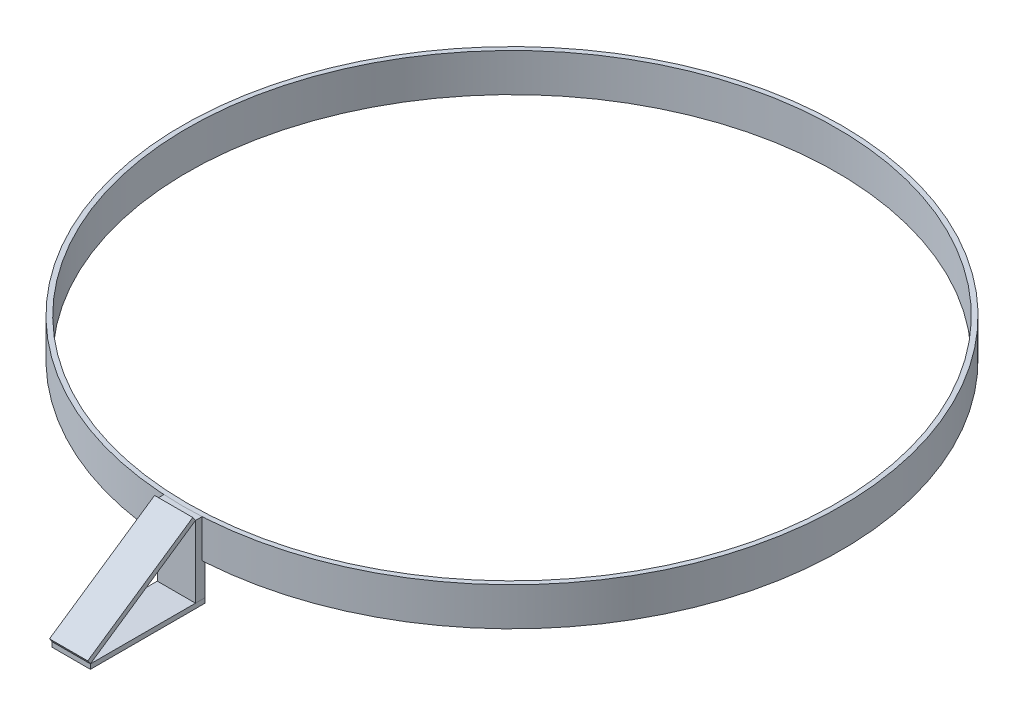
ISO-10303-21;
HEADER;
FILE_DESCRIPTION(('STEP AP214'),'2;1');
FILE_NAME('part.step','',(''),(''),'','','');
FILE_SCHEMA(('AUTOMOTIVE_DESIGN { 1 0 10303 214 1 1 1 1 }'));
ENDSEC;
DATA;
#1=APPLICATION_CONTEXT('core data for automotive mechanical design processes');
#2=APPLICATION_PROTOCOL_DEFINITION('international standard','automotive_design',2000,#1);
#3=PRODUCT_CONTEXT('',#1,'mechanical');
#4=PRODUCT('Part','Part','',(#3));
#5=PRODUCT_RELATED_PRODUCT_CATEGORY('part','',(#4));
#6=PRODUCT_DEFINITION_FORMATION('','',#4);
#7=PRODUCT_DEFINITION_CONTEXT('part definition',#1,'design');
#8=PRODUCT_DEFINITION('design','',#6,#7);
#9=PRODUCT_DEFINITION_SHAPE('','',#8);
#10=(LENGTH_UNIT() NAMED_UNIT(*) SI_UNIT(.MILLI.,.METRE.));
#11=(NAMED_UNIT(*) PLANE_ANGLE_UNIT() SI_UNIT($,.RADIAN.));
#12=(NAMED_UNIT(*) SI_UNIT($,.STERADIAN.) SOLID_ANGLE_UNIT());
#13=UNCERTAINTY_MEASURE_WITH_UNIT(LENGTH_MEASURE(1.E-05),#10,'distance_accuracy_value','');
#14=(GEOMETRIC_REPRESENTATION_CONTEXT(3) GLOBAL_UNCERTAINTY_ASSIGNED_CONTEXT((#13)) GLOBAL_UNIT_ASSIGNED_CONTEXT((#10,
#11,#12)) REPRESENTATION_CONTEXT('',''));
#15=CARTESIAN_POINT('',(0.,0.,0.));
#16=DIRECTION('',(0.,0.,1.));
#17=DIRECTION('',(1.,0.,0.));
#18=AXIS2_PLACEMENT_3D('',#15,#16,#17);
#19=CARTESIAN_POINT('',(12.7,28.023271813414,224.89497485237));
#20=DIRECTION('',(0.,-0.56333682464151,0.826227342807548));
#21=DIRECTION('',(0.,-0.826227342807548,-0.56333682464151));
#22=AXIS2_PLACEMENT_3D('',#19,#20,#21);
#23=PLANE('',#22);
#24=DIRECTION('',(-1.,0.,0.));
#25=VECTOR('',#24,1.);
#26=CARTESIAN_POINT('',(12.7,25.4,223.106380434133));
#27=LINE('',#26,#25);
#28=CARTESIAN_POINT('',(12.7,25.4,223.106380434133));
#29=VERTEX_POINT('',#28);
#30=CARTESIAN_POINT('',(-12.7,25.4,223.106380434133));
#31=VERTEX_POINT('',#30);
#32=EDGE_CURVE('E107',#29,#31,#27,.T.);
#33=ORIENTED_EDGE('',*,*,#32,.T.);
#34=DIRECTION('',(0.,-0.826227342807548,-0.56333682464151));
#35=VECTOR('',#34,1.);
#36=CARTESIAN_POINT('',(-12.7,28.023271813414,224.89497485237));
#37=LINE('',#36,#35);
#38=CARTESIAN_POINT('',(-12.7,28.023271813414,224.89497485237));
#39=VERTEX_POINT('',#38);
#40=EDGE_CURVE('E12',#39,#31,#37,.T.);
#41=ORIENTED_EDGE('',*,*,#40,.F.);
#42=DIRECTION('',(-1.,0.,0.));
#43=VECTOR('',#42,1.);
#44=CARTESIAN_POINT('',(12.7,28.023271813414,224.89497485237));
#45=LINE('',#44,#43);
#46=CARTESIAN_POINT('',(12.7,28.023271813414,224.89497485237));
#47=VERTEX_POINT('',#46);
#48=EDGE_CURVE('E95',#47,#39,#45,.T.);
#49=ORIENTED_EDGE('',*,*,#48,.F.);
#50=DIRECTION('',(0.,-0.826227342807548,-0.56333682464151));
#51=VECTOR('',#50,1.);
#52=CARTESIAN_POINT('',(12.7,28.023271813414,224.89497485237));
#53=LINE('',#52,#51);
#54=EDGE_CURVE('E103',#47,#29,#53,.T.);
#55=ORIENTED_EDGE('',*,*,#54,.T.);
#56=EDGE_LOOP('',(#33,#41,#49,#55));
#57=FACE_BOUND('',#56,.T.);
#58=ADVANCED_FACE('F44',(#57),#23,.F.);
#59=CARTESIAN_POINT('',(-12.7,28.023271813414,224.89497485237));
#60=DIRECTION('',(1.,0.,0.));
#61=DIRECTION('',(0.,0.,-1.));
#62=AXIS2_PLACEMENT_3D('',#59,#60,#61);
#63=PLANE('',#62);
#64=DIRECTION('',(0.,-0.56333682464151,0.826227342807548));
#65=VECTOR('',#64,1.);
#66=CARTESIAN_POINT('',(-12.7,25.4,223.106380434133));
#67=LINE('',#66,#65);
#68=CARTESIAN_POINT('',(-12.7,-22.225,292.956380434133));
#69=VERTEX_POINT('',#68);
#70=EDGE_CURVE('E99',#31,#69,#67,.T.);
#71=ORIENTED_EDGE('',*,*,#70,.T.);
#72=DIRECTION('',(0.,-0.826227342807548,-0.56333682464151));
#73=VECTOR('',#72,1.);
#74=CARTESIAN_POINT('',(-12.7,-19.601728186586,294.74497485237));
#75=LINE('',#74,#73);
#76=CARTESIAN_POINT('',(-12.7,-19.601728186586,294.74497485237));
#77=VERTEX_POINT('',#76);
#78=EDGE_CURVE('E52',#77,#69,#75,.T.);
#79=ORIENTED_EDGE('',*,*,#78,.F.);
#80=DIRECTION('',(0.,-0.56333682464151,0.826227342807548));
#81=VECTOR('',#80,1.);
#82=CARTESIAN_POINT('',(-12.7,28.023271813414,224.89497485237));
#83=LINE('',#82,#81);
#84=EDGE_CURVE('E90',#39,#77,#83,.T.);
#85=ORIENTED_EDGE('',*,*,#84,.F.);
#86=ORIENTED_EDGE('',*,*,#40,.T.);
#87=EDGE_LOOP('',(#71,#79,#85,#86));
#88=FACE_BOUND('',#87,.T.);
#89=ADVANCED_FACE('F98',(#88),#63,.F.);
#90=CARTESIAN_POINT('',(12.7,-19.601728186586,294.74497485237));
#91=DIRECTION('',(0.,0.56333682464151,-0.826227342807548));
#92=DIRECTION('',(0.,0.826227342807548,0.56333682464151));
#93=AXIS2_PLACEMENT_3D('',#90,#91,#92);
#94=PLANE('',#93);
#95=DIRECTION('',(1.,0.,0.));
#96=VECTOR('',#95,1.);
#97=CARTESIAN_POINT('',(12.7,-22.225,292.956380434133));
#98=LINE('',#97,#96);
#99=CARTESIAN_POINT('',(12.7,-22.225,292.956380434133));
#100=VERTEX_POINT('',#99);
#101=EDGE_CURVE('E77',#69,#100,#98,.T.);
#102=ORIENTED_EDGE('',*,*,#101,.T.);
#103=DIRECTION('',(0.,-0.826227342807548,-0.56333682464151));
#104=VECTOR('',#103,1.);
#105=CARTESIAN_POINT('',(12.7,-19.601728186586,294.74497485237));
#106=LINE('',#105,#104);
#107=CARTESIAN_POINT('',(12.7,-19.601728186586,294.74497485237));
#108=VERTEX_POINT('',#107);
#109=EDGE_CURVE('E100',#108,#100,#106,.T.);
#110=ORIENTED_EDGE('',*,*,#109,.F.);
#111=DIRECTION('',(1.,0.,0.));
#112=VECTOR('',#111,1.);
#113=CARTESIAN_POINT('',(12.7,-19.601728186586,294.74497485237));
#114=LINE('',#113,#112);
#115=EDGE_CURVE('E93',#77,#108,#114,.T.);
#116=ORIENTED_EDGE('',*,*,#115,.F.);
#117=ORIENTED_EDGE('',*,*,#78,.T.);
#118=EDGE_LOOP('',(#102,#110,#116,#117));
#119=FACE_BOUND('',#118,.T.);
#120=ADVANCED_FACE('F101',(#119),#94,.F.);
#121=CARTESIAN_POINT('',(12.7,28.023271813414,224.89497485237));
#122=DIRECTION('',(-1.,0.,0.));
#123=DIRECTION('',(0.,0.,1.));
#124=AXIS2_PLACEMENT_3D('',#121,#122,#123);
#125=PLANE('',#124);
#126=DIRECTION('',(0.,0.56333682464151,-0.826227342807548));
#127=VECTOR('',#126,1.);
#128=CARTESIAN_POINT('',(12.7,25.4,223.106380434133));
#129=LINE('',#128,#127);
#130=EDGE_CURVE('E83',#100,#29,#129,.T.);
#131=ORIENTED_EDGE('',*,*,#130,.T.);
#132=ORIENTED_EDGE('',*,*,#54,.F.);
#133=DIRECTION('',(0.,0.56333682464151,-0.826227342807548));
#134=VECTOR('',#133,1.);
#135=CARTESIAN_POINT('',(12.7,28.023271813414,224.89497485237));
#136=LINE('',#135,#134);
#137=EDGE_CURVE('E60',#108,#47,#136,.T.);
#138=ORIENTED_EDGE('',*,*,#137,.F.);
#139=ORIENTED_EDGE('',*,*,#109,.T.);
#140=EDGE_LOOP('',(#131,#132,#138,#139));
#141=FACE_BOUND('',#140,.T.);
#142=ADVANCED_FACE('F114',(#141),#125,.F.);
#143=CARTESIAN_POINT('',(0.,123.80621334129,84.413327278152));
#144=DIRECTION('',(0.,0.826227342807548,0.56333682464151));
#145=DIRECTION('',(0.,-0.56333682464151,0.826227342807548));
#146=AXIS2_PLACEMENT_3D('',#143,#144,#145);
#147=PLANE('',#146);
#148=ORIENTED_EDGE('',*,*,#48,.T.);
#149=ORIENTED_EDGE('',*,*,#84,.T.);
#150=ORIENTED_EDGE('',*,*,#115,.T.);
#151=ORIENTED_EDGE('',*,*,#137,.T.);
#152=EDGE_LOOP('',(#148,#149,#150,#151));
#153=FACE_BOUND('',#152,.T.);
#154=ADVANCED_FACE('F91',(#153),#147,.T.);
#155=CARTESIAN_POINT('',(0.,121.182941527876,82.6247328599152));
#156=DIRECTION('',(0.,0.826227342807548,0.56333682464151));
#157=DIRECTION('',(0.,-0.56333682464151,0.826227342807548));
#158=AXIS2_PLACEMENT_3D('',#155,#156,#157);
#159=PLANE('',#158);
#160=ORIENTED_EDGE('',*,*,#32,.F.);
#161=ORIENTED_EDGE('',*,*,#130,.F.);
#162=ORIENTED_EDGE('',*,*,#101,.F.);
#163=ORIENTED_EDGE('',*,*,#70,.F.);
#164=EDGE_LOOP('',(#160,#161,#162,#163));
#165=FACE_BOUND('',#164,.T.);
#166=ADVANCED_FACE('F117',(#165),#159,.F.);
#167=CLOSED_SHELL('',(#58,#89,#120,#142,#154,#166));
#168=MANIFOLD_SOLID_BREP('B2',#167);
#169=CARTESIAN_POINT('',(-12.7,-22.225,216.756380434133));
#170=DIRECTION('',(0.,0.,-1.));
#171=DIRECTION('',(-1.,0.,0.));
#172=AXIS2_PLACEMENT_3D('',#169,#170,#171);
#173=PLANE('',#172);
#174=DIRECTION('',(1.,0.,0.));
#175=VECTOR('',#174,1.);
#176=CARTESIAN_POINT('',(-12.7,-25.4,216.756380434133));
#177=LINE('',#176,#175);
#178=CARTESIAN_POINT('',(-12.7,-25.4,216.756380434133));
#179=VERTEX_POINT('',#178);
#180=CARTESIAN_POINT('',(12.7,-25.4,216.756380434133));
#181=VERTEX_POINT('',#180);
#182=EDGE_CURVE('E242',#179,#181,#177,.T.);
#183=ORIENTED_EDGE('',*,*,#182,.F.);
#184=DIRECTION('',(0.,-1.,0.));
#185=VECTOR('',#184,1.);
#186=CARTESIAN_POINT('',(-12.7,-22.225,216.756380434133));
#187=LINE('',#186,#185);
#188=CARTESIAN_POINT('',(-12.7,-22.225,216.756380434133));
#189=VERTEX_POINT('',#188);
#190=EDGE_CURVE('E42',#189,#179,#187,.T.);
#191=ORIENTED_EDGE('',*,*,#190,.F.);
#192=DIRECTION('',(1.,0.,0.));
#193=VECTOR('',#192,1.);
#194=CARTESIAN_POINT('',(-12.7,-22.225,216.756380434133));
#195=LINE('',#194,#193);
#196=CARTESIAN_POINT('',(12.7,-22.225,216.756380434133));
#197=VERTEX_POINT('',#196);
#198=EDGE_CURVE('E237',#189,#197,#195,.T.);
#199=ORIENTED_EDGE('',*,*,#198,.T.);
#200=DIRECTION('',(0.,-1.,0.));
#201=VECTOR('',#200,1.);
#202=CARTESIAN_POINT('',(12.7,-22.225,216.756380434133));
#203=LINE('',#202,#201);
#204=EDGE_CURVE('E180',#197,#181,#203,.T.);
#205=ORIENTED_EDGE('',*,*,#204,.T.);
#206=EDGE_LOOP('',(#183,#191,#199,#205));
#207=FACE_BOUND('',#206,.T.);
#208=ADVANCED_FACE('F177',(#207),#173,.T.);
#209=CARTESIAN_POINT('',(-12.7,-22.225,216.756380434133));
#210=DIRECTION('',(1.,0.,0.));
#211=DIRECTION('',(0.,0.,-1.));
#212=AXIS2_PLACEMENT_3D('',#209,#210,#211);
#213=PLANE('',#212);
#214=DIRECTION('',(0.,0.,1.));
#215=VECTOR('',#214,1.);
#216=CARTESIAN_POINT('',(-12.7,-25.4,216.756380434133));
#217=LINE('',#216,#215);
#218=CARTESIAN_POINT('',(-12.7,-25.4,292.956380434133));
#219=VERTEX_POINT('',#218);
#220=EDGE_CURVE('E210',#179,#219,#217,.T.);
#221=ORIENTED_EDGE('',*,*,#220,.T.);
#222=DIRECTION('',(0.,-1.,0.));
#223=VECTOR('',#222,1.);
#224=CARTESIAN_POINT('',(-12.7,-22.225,292.956380434133));
#225=LINE('',#224,#223);
#226=CARTESIAN_POINT('',(-12.7,-22.225,292.956380434133));
#227=VERTEX_POINT('',#226);
#228=EDGE_CURVE('E186',#227,#219,#225,.T.);
#229=ORIENTED_EDGE('',*,*,#228,.F.);
#230=DIRECTION('',(0.,0.,1.));
#231=VECTOR('',#230,1.);
#232=CARTESIAN_POINT('',(-12.7,-22.225,216.756380434133));
#233=LINE('',#232,#231);
#234=EDGE_CURVE('E227',#189,#227,#233,.T.);
#235=ORIENTED_EDGE('',*,*,#234,.F.);
#236=ORIENTED_EDGE('',*,*,#190,.T.);
#237=EDGE_LOOP('',(#221,#229,#235,#236));
#238=FACE_BOUND('',#237,.T.);
#239=ADVANCED_FACE('F252',(#238),#213,.F.);
#240=CARTESIAN_POINT('',(-12.7,-22.225,292.956380434133));
#241=DIRECTION('',(0.,0.,-1.));
#242=DIRECTION('',(-1.,0.,0.));
#243=AXIS2_PLACEMENT_3D('',#240,#241,#242);
#244=PLANE('',#243);
#245=DIRECTION('',(1.,0.,0.));
#246=VECTOR('',#245,1.);
#247=CARTESIAN_POINT('',(-12.7,-25.4,292.956380434133));
#248=LINE('',#247,#246);
#249=CARTESIAN_POINT('',(12.7,-25.4,292.956380434133));
#250=VERTEX_POINT('',#249);
#251=EDGE_CURVE('E234',#219,#250,#248,.T.);
#252=ORIENTED_EDGE('',*,*,#251,.T.);
#253=DIRECTION('',(0.,-1.,0.));
#254=VECTOR('',#253,1.);
#255=CARTESIAN_POINT('',(12.7,-22.225,292.956380434133));
#256=LINE('',#255,#254);
#257=CARTESIAN_POINT('',(12.7,-22.225,292.956380434133));
#258=VERTEX_POINT('',#257);
#259=EDGE_CURVE('E231',#258,#250,#256,.T.);
#260=ORIENTED_EDGE('',*,*,#259,.F.);
#261=DIRECTION('',(1.,0.,0.));
#262=VECTOR('',#261,1.);
#263=CARTESIAN_POINT('',(-12.7,-22.225,292.956380434133));
#264=LINE('',#263,#262);
#265=EDGE_CURVE('E222',#227,#258,#264,.T.);
#266=ORIENTED_EDGE('',*,*,#265,.F.);
#267=ORIENTED_EDGE('',*,*,#228,.T.);
#268=EDGE_LOOP('',(#252,#260,#266,#267));
#269=FACE_BOUND('',#268,.T.);
#270=ADVANCED_FACE('F232',(#269),#244,.F.);
#271=CARTESIAN_POINT('',(12.7,-22.225,216.756380434133));
#272=DIRECTION('',(1.,0.,0.));
#273=DIRECTION('',(0.,0.,-1.));
#274=AXIS2_PLACEMENT_3D('',#271,#272,#273);
#275=PLANE('',#274);
#276=DIRECTION('',(0.,0.,1.));
#277=VECTOR('',#276,1.);
#278=CARTESIAN_POINT('',(12.7,-25.4,216.756380434133));
#279=LINE('',#278,#277);
#280=EDGE_CURVE('E245',#181,#250,#279,.T.);
#281=ORIENTED_EDGE('',*,*,#280,.F.);
#282=ORIENTED_EDGE('',*,*,#204,.F.);
#283=DIRECTION('',(0.,0.,1.));
#284=VECTOR('',#283,1.);
#285=CARTESIAN_POINT('',(12.7,-22.225,216.756380434133));
#286=LINE('',#285,#284);
#287=EDGE_CURVE('E226',#197,#258,#286,.T.);
#288=ORIENTED_EDGE('',*,*,#287,.T.);
#289=ORIENTED_EDGE('',*,*,#259,.T.);
#290=EDGE_LOOP('',(#281,#282,#288,#289));
#291=FACE_BOUND('',#290,.T.);
#292=ADVANCED_FACE('F236',(#291),#275,.T.);
#293=CARTESIAN_POINT('',(0.,-22.225,0.));
#294=DIRECTION('',(0.,-1.,0.));
#295=DIRECTION('',(0.,0.,-1.));
#296=AXIS2_PLACEMENT_3D('',#293,#294,#295);
#297=PLANE('',#296);
#298=ORIENTED_EDGE('',*,*,#198,.F.);
#299=ORIENTED_EDGE('',*,*,#234,.T.);
#300=ORIENTED_EDGE('',*,*,#265,.T.);
#301=ORIENTED_EDGE('',*,*,#287,.F.);
#302=EDGE_LOOP('',(#298,#299,#300,#301));
#303=FACE_BOUND('',#302,.T.);
#304=ADVANCED_FACE('F225',(#303),#297,.F.);
#305=CARTESIAN_POINT('',(0.,-25.4,0.));
#306=DIRECTION('',(0.,-1.,0.));
#307=DIRECTION('',(0.,0.,-1.));
#308=AXIS2_PLACEMENT_3D('',#305,#306,#307);
#309=PLANE('',#308);
#310=ORIENTED_EDGE('',*,*,#182,.T.);
#311=ORIENTED_EDGE('',*,*,#280,.T.);
#312=ORIENTED_EDGE('',*,*,#251,.F.);
#313=ORIENTED_EDGE('',*,*,#220,.F.);
#314=EDGE_LOOP('',(#310,#311,#312,#313));
#315=FACE_BOUND('',#314,.T.);
#316=ADVANCED_FACE('F250',(#315),#309,.T.);
#317=CLOSED_SHELL('',(#208,#239,#270,#292,#304,#316));
#318=MANIFOLD_SOLID_BREP('B6',#317);
#319=CARTESIAN_POINT('',(-12.7,25.4,216.756380434133));
#320=DIRECTION('',(1.,0.,0.));
#321=DIRECTION('',(0.,0.,-1.));
#322=AXIS2_PLACEMENT_3D('',#319,#320,#321);
#323=PLANE('',#322);
#324=DIRECTION('',(0.,0.,1.));
#325=VECTOR('',#324,1.);
#326=CARTESIAN_POINT('',(-12.7,-25.4,216.756380434133));
#327=LINE('',#326,#325);
#328=CARTESIAN_POINT('',(-12.7,-25.4,216.756380434133));
#329=VERTEX_POINT('',#328);
#330=CARTESIAN_POINT('',(-12.7,-25.4,223.106380434133));
#331=VERTEX_POINT('',#330);
#332=EDGE_CURVE('E370',#329,#331,#327,.T.);
#333=ORIENTED_EDGE('',*,*,#332,.T.);
#334=DIRECTION('',(0.,-1.,0.));
#335=VECTOR('',#334,1.);
#336=CARTESIAN_POINT('',(-12.7,25.4,223.106380434133));
#337=LINE('',#336,#335);
#338=CARTESIAN_POINT('',(-12.7,25.4,223.106380434133));
#339=VERTEX_POINT('',#338);
#340=EDGE_CURVE('E175',#339,#331,#337,.T.);
#341=ORIENTED_EDGE('',*,*,#340,.F.);
#342=DIRECTION('',(0.,0.,1.));
#343=VECTOR('',#342,1.);
#344=CARTESIAN_POINT('',(-12.7,25.4,216.756380434133));
#345=LINE('',#344,#343);
#346=CARTESIAN_POINT('',(-12.7,25.4,216.756380434133));
#347=VERTEX_POINT('',#346);
#348=EDGE_CURVE('E356',#347,#339,#345,.T.);
#349=ORIENTED_EDGE('',*,*,#348,.F.);
#350=DIRECTION('',(0.,-1.,0.));
#351=VECTOR('',#350,1.);
#352=CARTESIAN_POINT('',(-12.7,25.4,216.756380434133));
#353=LINE('',#352,#351);
#354=EDGE_CURVE('E323',#347,#329,#353,.T.);
#355=ORIENTED_EDGE('',*,*,#354,.T.);
#356=EDGE_LOOP('',(#333,#341,#349,#355));
#357=FACE_BOUND('',#356,.T.);
#358=ADVANCED_FACE('F307',(#357),#323,.F.);
#359=CARTESIAN_POINT('',(-12.7,25.4,223.106380434133));
#360=DIRECTION('',(0.,0.,-1.));
#361=DIRECTION('',(-1.,0.,0.));
#362=AXIS2_PLACEMENT_3D('',#359,#360,#361);
#363=PLANE('',#362);
#364=DIRECTION('',(1.,0.,0.));
#365=VECTOR('',#364,1.);
#366=CARTESIAN_POINT('',(-12.7,-25.4,223.106380434133));
#367=LINE('',#366,#365);
#368=CARTESIAN_POINT('',(12.7,-25.4,223.106380434133));
#369=VERTEX_POINT('',#368);
#370=EDGE_CURVE('E361',#331,#369,#367,.T.);
#371=ORIENTED_EDGE('',*,*,#370,.T.);
#372=DIRECTION('',(0.,-1.,0.));
#373=VECTOR('',#372,1.);
#374=CARTESIAN_POINT('',(12.7,25.4,223.106380434133));
#375=LINE('',#374,#373);
#376=CARTESIAN_POINT('',(12.7,25.4,223.106380434133));
#377=VERTEX_POINT('',#376);
#378=EDGE_CURVE('E315',#377,#369,#375,.T.);
#379=ORIENTED_EDGE('',*,*,#378,.F.);
#380=DIRECTION('',(1.,0.,0.));
#381=VECTOR('',#380,1.);
#382=CARTESIAN_POINT('',(-12.7,25.4,223.106380434133));
#383=LINE('',#382,#381);
#384=EDGE_CURVE('E348',#339,#377,#383,.T.);
#385=ORIENTED_EDGE('',*,*,#384,.F.);
#386=ORIENTED_EDGE('',*,*,#340,.T.);
#387=EDGE_LOOP('',(#371,#379,#385,#386));
#388=FACE_BOUND('',#387,.T.);
#389=ADVANCED_FACE('F360',(#388),#363,.F.);
#390=CARTESIAN_POINT('',(12.7,25.4,216.756380434133));
#391=DIRECTION('',(1.,0.,0.));
#392=DIRECTION('',(0.,0.,-1.));
#393=AXIS2_PLACEMENT_3D('',#390,#391,#392);
#394=PLANE('',#393);
#395=DIRECTION('',(0.,0.,1.));
#396=VECTOR('',#395,1.);
#397=CARTESIAN_POINT('',(12.7,-25.4,216.756380434133));
#398=LINE('',#397,#396);
#399=CARTESIAN_POINT('',(12.7,-25.4,216.756380434133));
#400=VERTEX_POINT('',#399);
#401=EDGE_CURVE('E373',#400,#369,#398,.T.);
#402=ORIENTED_EDGE('',*,*,#401,.F.);
#403=DIRECTION('',(0.,-1.,0.));
#404=VECTOR('',#403,1.);
#405=CARTESIAN_POINT('',(12.7,25.4,216.756380434133));
#406=LINE('',#405,#404);
#407=CARTESIAN_POINT('',(12.7,25.4,216.756380434133));
#408=VERTEX_POINT('',#407);
#409=EDGE_CURVE('E337',#408,#400,#406,.T.);
#410=ORIENTED_EDGE('',*,*,#409,.F.);
#411=DIRECTION('',(0.,0.,1.));
#412=VECTOR('',#411,1.);
#413=CARTESIAN_POINT('',(12.7,25.4,216.756380434133));
#414=LINE('',#413,#412);
#415=EDGE_CURVE('E355',#408,#377,#414,.T.);
#416=ORIENTED_EDGE('',*,*,#415,.T.);
#417=ORIENTED_EDGE('',*,*,#378,.T.);
#418=EDGE_LOOP('',(#402,#410,#416,#417));
#419=FACE_BOUND('',#418,.T.);
#420=ADVANCED_FACE('F364',(#419),#394,.T.);
#421=CARTESIAN_POINT('',(-12.7,25.4,216.756380434133));
#422=DIRECTION('',(0.,0.,-1.));
#423=DIRECTION('',(-1.,0.,0.));
#424=AXIS2_PLACEMENT_3D('',#421,#422,#423);
#425=PLANE('',#424);
#426=DIRECTION('',(1.,0.,0.));
#427=VECTOR('',#426,1.);
#428=CARTESIAN_POINT('',(-12.7,-25.4,216.756380434133));
#429=LINE('',#428,#427);
#430=EDGE_CURVE('E375',#329,#400,#429,.T.);
#431=ORIENTED_EDGE('',*,*,#430,.F.);
#432=ORIENTED_EDGE('',*,*,#354,.F.);
#433=DIRECTION('',(1.,0.,0.));
#434=VECTOR('',#433,1.);
#435=CARTESIAN_POINT('',(-12.7,25.4,216.756380434133));
#436=LINE('',#435,#434);
#437=EDGE_CURVE('E365',#347,#408,#436,.T.);
#438=ORIENTED_EDGE('',*,*,#437,.T.);
#439=ORIENTED_EDGE('',*,*,#409,.T.);
#440=EDGE_LOOP('',(#431,#432,#438,#439));
#441=FACE_BOUND('',#440,.T.);
#442=ADVANCED_FACE('F381',(#441),#425,.T.);
#443=CARTESIAN_POINT('',(0.,25.4,0.));
#444=DIRECTION('',(0.,1.,0.));
#445=DIRECTION('',(0.,0.,1.));
#446=AXIS2_PLACEMENT_3D('',#443,#444,#445);
#447=PLANE('',#446);
#448=ORIENTED_EDGE('',*,*,#348,.T.);
#449=ORIENTED_EDGE('',*,*,#384,.T.);
#450=ORIENTED_EDGE('',*,*,#415,.F.);
#451=ORIENTED_EDGE('',*,*,#437,.F.);
#452=EDGE_LOOP('',(#448,#449,#450,#451));
#453=FACE_BOUND('',#452,.T.);
#454=ADVANCED_FACE('F352',(#453),#447,.T.);
#455=CARTESIAN_POINT('',(0.,-25.4,0.));
#456=DIRECTION('',(0.,1.,0.));
#457=DIRECTION('',(0.,0.,1.));
#458=AXIS2_PLACEMENT_3D('',#455,#456,#457);
#459=PLANE('',#458);
#460=ORIENTED_EDGE('',*,*,#332,.F.);
#461=ORIENTED_EDGE('',*,*,#430,.T.);
#462=ORIENTED_EDGE('',*,*,#401,.T.);
#463=ORIENTED_EDGE('',*,*,#370,.F.);
#464=EDGE_LOOP('',(#460,#461,#462,#463));
#465=FACE_BOUND('',#464,.T.);
#466=ADVANCED_FACE('F380',(#465),#459,.F.);
#467=CLOSED_SHELL('',(#358,#389,#420,#442,#454,#466));
#468=MANIFOLD_SOLID_BREP('B36',#467);
#469=CARTESIAN_POINT('',(0.,25.4,0.));
#470=DIRECTION('',(0.,-1.,0.));
#471=DIRECTION('',(0.,0.,-1.));
#472=AXIS2_PLACEMENT_3D('',#469,#470,#471);
#473=CYLINDRICAL_SURFACE('',#472,219.075);
#474=CARTESIAN_POINT('',(0.,25.4,0.));
#475=DIRECTION('',(0.,1.,0.));
#476=DIRECTION('',(0.,0.,1.));
#477=AXIS2_PLACEMENT_3D('',#474,#475,#476);
#478=CIRCLE('',#477,219.075);
#479=CARTESIAN_POINT('',(0.,25.4,219.075));
#480=VERTEX_POINT('',#479);
#481=EDGE_CURVE('E306',#480,#480,#478,.T.);
#482=ORIENTED_EDGE('',*,*,#481,.F.);
#483=EDGE_LOOP('',(#482));
#484=FACE_BOUND('',#483,.T.);
#485=CARTESIAN_POINT('',(0.,0.,0.));
#486=DIRECTION('',(0.,1.,0.));
#487=DIRECTION('',(0.,0.,1.));
#488=AXIS2_PLACEMENT_3D('',#485,#486,#487);
#489=CIRCLE('',#488,219.075);
#490=CARTESIAN_POINT('',(0.,0.,219.075));
#491=VERTEX_POINT('',#490);
#492=EDGE_CURVE('E433',#491,#491,#489,.T.);
#493=ORIENTED_EDGE('',*,*,#492,.T.);
#494=EDGE_LOOP('',(#493));
#495=FACE_BOUND('',#494,.T.);
#496=ADVANCED_FACE('F430',(#484,#495),#473,.T.);
#497=CARTESIAN_POINT('',(0.,25.4,0.));
#498=DIRECTION('',(0.,1.,0.));
#499=DIRECTION('',(0.,0.,1.));
#500=AXIS2_PLACEMENT_3D('',#497,#498,#499);
#501=PLANE('',#500);
#502=CARTESIAN_POINT('',(0.,25.4,0.));
#503=DIRECTION('',(0.,1.,0.));
#504=DIRECTION('',(0.,0.,1.));
#505=AXIS2_PLACEMENT_3D('',#502,#503,#504);
#506=CIRCLE('',#505,215.9);
#507=CARTESIAN_POINT('',(0.,25.4,215.9));
#508=VERTEX_POINT('',#507);
#509=EDGE_CURVE('E442',#508,#508,#506,.T.);
#510=ORIENTED_EDGE('',*,*,#509,.F.);
#511=EDGE_LOOP('',(#510));
#512=FACE_BOUND('',#511,.T.);
#513=ORIENTED_EDGE('',*,*,#481,.T.);
#514=EDGE_LOOP('',(#513));
#515=FACE_BOUND('',#514,.T.);
#516=ADVANCED_FACE('F457',(#512,#515),#501,.T.);
#517=CARTESIAN_POINT('',(0.,0.,0.));
#518=DIRECTION('',(0.,1.,0.));
#519=DIRECTION('',(0.,0.,1.));
#520=AXIS2_PLACEMENT_3D('',#517,#518,#519);
#521=PLANE('',#520);
#522=CARTESIAN_POINT('',(0.,0.,0.));
#523=DIRECTION('',(0.,1.,0.));
#524=DIRECTION('',(0.,0.,1.));
#525=AXIS2_PLACEMENT_3D('',#522,#523,#524);
#526=CIRCLE('',#525,215.9);
#527=CARTESIAN_POINT('',(0.,0.,215.9));
#528=VERTEX_POINT('',#527);
#529=EDGE_CURVE('E440',#528,#528,#526,.T.);
#530=ORIENTED_EDGE('',*,*,#529,.T.);
#531=EDGE_LOOP('',(#530));
#532=FACE_BOUND('',#531,.T.);
#533=ORIENTED_EDGE('',*,*,#492,.F.);
#534=EDGE_LOOP('',(#533));
#535=FACE_BOUND('',#534,.T.);
#536=ADVANCED_FACE('F448',(#532,#535),#521,.F.);
#537=CARTESIAN_POINT('',(0.,0.,0.));
#538=DIRECTION('',(0.,1.,0.));
#539=DIRECTION('',(0.,0.,1.));
#540=AXIS2_PLACEMENT_3D('',#537,#538,#539);
#541=CYLINDRICAL_SURFACE('',#540,215.9);
#542=ORIENTED_EDGE('',*,*,#529,.F.);
#543=EDGE_LOOP('',(#542));
#544=FACE_BOUND('',#543,.T.);
#545=ORIENTED_EDGE('',*,*,#509,.T.);
#546=EDGE_LOOP('',(#545));
#547=FACE_BOUND('',#546,.T.);
#548=ADVANCED_FACE('F451',(#544,#547),#541,.F.);
#549=CLOSED_SHELL('',(#496,#516,#536,#548));
#550=MANIFOLD_SOLID_BREP('B169',#549);
#551=ADVANCED_BREP_SHAPE_REPRESENTATION('',(#18,#168,#318,#468,#550),#14);
#552=SHAPE_DEFINITION_REPRESENTATION(#9,#551);
ENDSEC;
END-ISO-10303-21;
